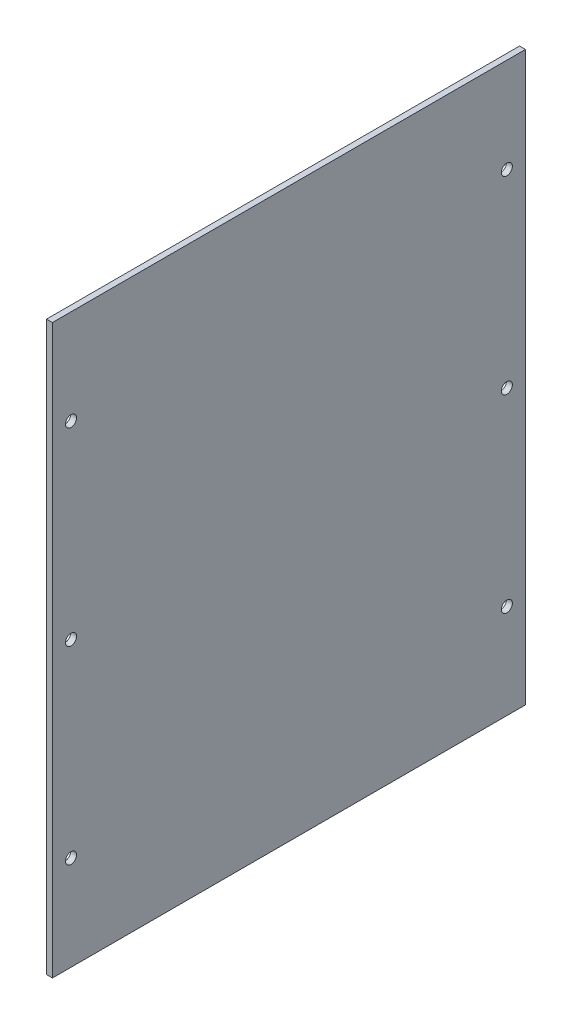
ISO-10303-21;
HEADER;
FILE_DESCRIPTION(('STEP AP214'),'2;1');
FILE_NAME('part.step','',(''),(''),'','','');
FILE_SCHEMA(('AUTOMOTIVE_DESIGN { 1 0 10303 214 1 1 1 1 }'));
ENDSEC;
DATA;
#1=APPLICATION_CONTEXT('core data for automotive mechanical design processes');
#2=APPLICATION_PROTOCOL_DEFINITION('international standard','automotive_design',2000,#1);
#3=PRODUCT_CONTEXT('',#1,'mechanical');
#4=PRODUCT('Part','Part','',(#3));
#5=PRODUCT_RELATED_PRODUCT_CATEGORY('part','',(#4));
#6=PRODUCT_DEFINITION_FORMATION('','',#4);
#7=PRODUCT_DEFINITION_CONTEXT('part definition',#1,'design');
#8=PRODUCT_DEFINITION('design','',#6,#7);
#9=PRODUCT_DEFINITION_SHAPE('','',#8);
#10=(LENGTH_UNIT() NAMED_UNIT(*) SI_UNIT(.MILLI.,.METRE.));
#11=(NAMED_UNIT(*) PLANE_ANGLE_UNIT() SI_UNIT($,.RADIAN.));
#12=(NAMED_UNIT(*) SI_UNIT($,.STERADIAN.) SOLID_ANGLE_UNIT());
#13=UNCERTAINTY_MEASURE_WITH_UNIT(LENGTH_MEASURE(1.E-05),#10,'distance_accuracy_value','');
#14=(GEOMETRIC_REPRESENTATION_CONTEXT(3) GLOBAL_UNCERTAINTY_ASSIGNED_CONTEXT((#13)) GLOBAL_UNIT_ASSIGNED_CONTEXT((#10,
#11,#12)) REPRESENTATION_CONTEXT('',''));
#15=CARTESIAN_POINT('',(0.,0.,0.));
#16=DIRECTION('',(0.,0.,1.));
#17=DIRECTION('',(1.,0.,0.));
#18=AXIS2_PLACEMENT_3D('',#15,#16,#17);
#19=CARTESIAN_POINT('',(-1.5875,152.4,127.));
#20=DIRECTION('',(1.,0.,0.));
#21=DIRECTION('',(0.,0.,-1.));
#22=AXIS2_PLACEMENT_3D('',#19,#20,#21);
#23=PLANE('',#22);
#24=DIRECTION('',(0.,1.,0.));
#25=VECTOR('',#24,1.);
#26=CARTESIAN_POINT('',(-1.5875,152.4,127.));
#27=LINE('',#26,#25);
#28=CARTESIAN_POINT('',(-1.5875,-152.4,127.));
#29=VERTEX_POINT('',#28);
#30=CARTESIAN_POINT('',(-1.5875,152.4,127.));
#31=VERTEX_POINT('',#30);
#32=EDGE_CURVE('E68',#29,#31,#27,.T.);
#33=ORIENTED_EDGE('',*,*,#32,.T.);
#34=DIRECTION('',(0.,0.,-1.));
#35=VECTOR('',#34,1.);
#36=CARTESIAN_POINT('',(-1.5875,152.4,0.));
#37=LINE('',#36,#35);
#38=CARTESIAN_POINT('',(-1.5875,152.4,-127.));
#39=VERTEX_POINT('',#38);
#40=EDGE_CURVE('E64',#31,#39,#37,.T.);
#41=ORIENTED_EDGE('',*,*,#40,.T.);
#42=DIRECTION('',(0.,1.,0.));
#43=VECTOR('',#42,1.);
#44=CARTESIAN_POINT('',(-1.5875,152.4,-127.));
#45=LINE('',#44,#43);
#46=CARTESIAN_POINT('',(-1.5875,-152.4,-127.));
#47=VERTEX_POINT('',#46);
#48=EDGE_CURVE('E295',#39,#47,#45,.F.);
#49=ORIENTED_EDGE('',*,*,#48,.T.);
#50=DIRECTION('',(0.,0.,-1.));
#51=VECTOR('',#50,1.);
#52=CARTESIAN_POINT('',(-1.5875,-152.4,0.));
#53=LINE('',#52,#51);
#54=EDGE_CURVE('E70',#29,#47,#53,.T.);
#55=ORIENTED_EDGE('',*,*,#54,.F.);
#56=EDGE_LOOP('',(#33,#41,#49,#55));
#57=FACE_BOUND('',#56,.T.);
#58=CARTESIAN_POINT('',(-1.5875,0.,-117.));
#59=DIRECTION('',(1.,0.,0.));
#60=DIRECTION('',(0.,0.,-1.));
#61=AXIS2_PLACEMENT_3D('',#58,#59,#60);
#62=CIRCLE('',#61,2.9718);
#63=CARTESIAN_POINT('',(-1.5875,0.,-119.9718));
#64=VERTEX_POINT('',#63);
#65=EDGE_CURVE('E77',#64,#64,#62,.T.);
#66=ORIENTED_EDGE('',*,*,#65,.T.);
#67=EDGE_LOOP('',(#66));
#68=FACE_BOUND('',#67,.T.);
#69=CARTESIAN_POINT('',(-1.5875,101.599999999999,117.));
#70=DIRECTION('',(1.,0.,0.));
#71=DIRECTION('',(0.,0.,-1.));
#72=AXIS2_PLACEMENT_3D('',#69,#70,#71);
#73=CIRCLE('',#72,2.9718);
#74=CARTESIAN_POINT('',(-1.5875,101.599999999999,114.0282));
#75=VERTEX_POINT('',#74);
#76=EDGE_CURVE('E124',#75,#75,#73,.T.);
#77=ORIENTED_EDGE('',*,*,#76,.T.);
#78=EDGE_LOOP('',(#77));
#79=FACE_BOUND('',#78,.T.);
#80=CARTESIAN_POINT('',(-1.5875,-101.600000000001,116.999999999999));
#81=DIRECTION('',(1.,0.,0.));
#82=DIRECTION('',(0.,0.,-1.));
#83=AXIS2_PLACEMENT_3D('',#80,#81,#82);
#84=CIRCLE('',#83,2.9718);
#85=CARTESIAN_POINT('',(-1.5875,-101.600000000001,114.028199999999));
#86=VERTEX_POINT('',#85);
#87=EDGE_CURVE('E127',#86,#86,#84,.T.);
#88=ORIENTED_EDGE('',*,*,#87,.T.);
#89=EDGE_LOOP('',(#88));
#90=FACE_BOUND('',#89,.T.);
#91=CARTESIAN_POINT('',(-1.5875,-8.32667268468867E-13,117.));
#92=DIRECTION('',(1.,0.,0.));
#93=DIRECTION('',(0.,0.,-1.));
#94=AXIS2_PLACEMENT_3D('',#91,#92,#93);
#95=CIRCLE('',#94,2.9718);
#96=CARTESIAN_POINT('',(-1.5875,-8.32667268468867E-13,114.0282));
#97=VERTEX_POINT('',#96);
#98=EDGE_CURVE('E131',#97,#97,#95,.T.);
#99=ORIENTED_EDGE('',*,*,#98,.T.);
#100=EDGE_LOOP('',(#99));
#101=FACE_BOUND('',#100,.T.);
#102=CARTESIAN_POINT('',(-1.5875,-101.6,-116.999999999999));
#103=DIRECTION('',(1.,0.,0.));
#104=DIRECTION('',(0.,0.,-1.));
#105=AXIS2_PLACEMENT_3D('',#102,#103,#104);
#106=CIRCLE('',#105,2.9718);
#107=CARTESIAN_POINT('',(-1.5875,-101.6,-119.971799999999));
#108=VERTEX_POINT('',#107);
#109=EDGE_CURVE('E134',#108,#108,#106,.T.);
#110=ORIENTED_EDGE('',*,*,#109,.T.);
#111=EDGE_LOOP('',(#110));
#112=FACE_BOUND('',#111,.T.);
#113=CARTESIAN_POINT('',(-1.5875,101.6,-116.999999999999));
#114=DIRECTION('',(1.,0.,0.));
#115=DIRECTION('',(0.,0.,-1.));
#116=AXIS2_PLACEMENT_3D('',#113,#114,#115);
#117=CIRCLE('',#116,2.9718);
#118=CARTESIAN_POINT('',(-1.5875,101.6,-119.971799999999));
#119=VERTEX_POINT('',#118);
#120=EDGE_CURVE('E20',#119,#119,#117,.T.);
#121=ORIENTED_EDGE('',*,*,#120,.T.);
#122=EDGE_LOOP('',(#121));
#123=FACE_BOUND('',#122,.T.);
#124=ADVANCED_FACE('F17',(#57,#68,#79,#90,#101,#112,#123),#23,.F.);
#125=CARTESIAN_POINT('',(-1.5875,101.6,-116.999999999999));
#126=DIRECTION('',(1.,0.,0.));
#127=DIRECTION('',(0.,0.,-1.));
#128=AXIS2_PLACEMENT_3D('',#125,#126,#127);
#129=CYLINDRICAL_SURFACE('',#128,2.9718);
#130=ORIENTED_EDGE('',*,*,#120,.F.);
#131=EDGE_LOOP('',(#130));
#132=FACE_BOUND('',#131,.T.);
#133=CARTESIAN_POINT('',(1.5875,101.6,-116.999999999999));
#134=DIRECTION('',(1.,0.,0.));
#135=DIRECTION('',(0.,0.,-1.));
#136=AXIS2_PLACEMENT_3D('',#133,#134,#135);
#137=CIRCLE('',#136,2.9718);
#138=CARTESIAN_POINT('',(1.5875,101.6,-119.971799999999));
#139=VERTEX_POINT('',#138);
#140=EDGE_CURVE('E117',#139,#139,#137,.T.);
#141=ORIENTED_EDGE('',*,*,#140,.T.);
#142=EDGE_LOOP('',(#141));
#143=FACE_BOUND('',#142,.T.);
#144=ADVANCED_FACE('F144',(#132,#143),#129,.F.);
#145=CARTESIAN_POINT('',(-1.5875,-101.6,-116.999999999999));
#146=DIRECTION('',(1.,0.,0.));
#147=DIRECTION('',(0.,0.,-1.));
#148=AXIS2_PLACEMENT_3D('',#145,#146,#147);
#149=CYLINDRICAL_SURFACE('',#148,2.9718);
#150=ORIENTED_EDGE('',*,*,#109,.F.);
#151=EDGE_LOOP('',(#150));
#152=FACE_BOUND('',#151,.T.);
#153=CARTESIAN_POINT('',(1.5875,-101.6,-116.999999999999));
#154=DIRECTION('',(1.,0.,0.));
#155=DIRECTION('',(0.,0.,-1.));
#156=AXIS2_PLACEMENT_3D('',#153,#154,#155);
#157=CIRCLE('',#156,2.9718);
#158=CARTESIAN_POINT('',(1.5875,-101.6,-119.971799999999));
#159=VERTEX_POINT('',#158);
#160=EDGE_CURVE('E113',#159,#159,#157,.T.);
#161=ORIENTED_EDGE('',*,*,#160,.T.);
#162=EDGE_LOOP('',(#161));
#163=FACE_BOUND('',#162,.T.);
#164=ADVANCED_FACE('F147',(#152,#163),#149,.F.);
#165=CARTESIAN_POINT('',(-1.5875,-8.32667268468867E-13,117.));
#166=DIRECTION('',(1.,0.,0.));
#167=DIRECTION('',(0.,0.,-1.));
#168=AXIS2_PLACEMENT_3D('',#165,#166,#167);
#169=CYLINDRICAL_SURFACE('',#168,2.9718);
#170=ORIENTED_EDGE('',*,*,#98,.F.);
#171=EDGE_LOOP('',(#170));
#172=FACE_BOUND('',#171,.T.);
#173=CARTESIAN_POINT('',(1.5875,-8.32667268468867E-13,117.));
#174=DIRECTION('',(1.,0.,0.));
#175=DIRECTION('',(0.,0.,-1.));
#176=AXIS2_PLACEMENT_3D('',#173,#174,#175);
#177=CIRCLE('',#176,2.9718);
#178=CARTESIAN_POINT('',(1.5875,-8.32667268468867E-13,114.0282));
#179=VERTEX_POINT('',#178);
#180=EDGE_CURVE('E109',#179,#179,#177,.T.);
#181=ORIENTED_EDGE('',*,*,#180,.T.);
#182=EDGE_LOOP('',(#181));
#183=FACE_BOUND('',#182,.T.);
#184=ADVANCED_FACE('F182',(#172,#183),#169,.F.);
#185=CARTESIAN_POINT('',(-1.5875,-101.600000000001,116.999999999999));
#186=DIRECTION('',(1.,0.,0.));
#187=DIRECTION('',(0.,0.,-1.));
#188=AXIS2_PLACEMENT_3D('',#185,#186,#187);
#189=CYLINDRICAL_SURFACE('',#188,2.9718);
#190=ORIENTED_EDGE('',*,*,#87,.F.);
#191=EDGE_LOOP('',(#190));
#192=FACE_BOUND('',#191,.T.);
#193=CARTESIAN_POINT('',(1.5875,-101.600000000001,116.999999999999));
#194=DIRECTION('',(1.,0.,0.));
#195=DIRECTION('',(0.,0.,-1.));
#196=AXIS2_PLACEMENT_3D('',#193,#194,#195);
#197=CIRCLE('',#196,2.9718);
#198=CARTESIAN_POINT('',(1.5875,-101.600000000001,114.028199999999));
#199=VERTEX_POINT('',#198);
#200=EDGE_CURVE('E105',#199,#199,#197,.T.);
#201=ORIENTED_EDGE('',*,*,#200,.T.);
#202=EDGE_LOOP('',(#201));
#203=FACE_BOUND('',#202,.T.);
#204=ADVANCED_FACE('F178',(#192,#203),#189,.F.);
#205=CARTESIAN_POINT('',(-1.5875,101.599999999999,117.));
#206=DIRECTION('',(1.,0.,0.));
#207=DIRECTION('',(0.,0.,-1.));
#208=AXIS2_PLACEMENT_3D('',#205,#206,#207);
#209=CYLINDRICAL_SURFACE('',#208,2.9718);
#210=ORIENTED_EDGE('',*,*,#76,.F.);
#211=EDGE_LOOP('',(#210));
#212=FACE_BOUND('',#211,.T.);
#213=CARTESIAN_POINT('',(1.5875,101.599999999999,117.));
#214=DIRECTION('',(1.,0.,0.));
#215=DIRECTION('',(0.,0.,-1.));
#216=AXIS2_PLACEMENT_3D('',#213,#214,#215);
#217=CIRCLE('',#216,2.9718);
#218=CARTESIAN_POINT('',(1.5875,101.599999999999,114.0282));
#219=VERTEX_POINT('',#218);
#220=EDGE_CURVE('E101',#219,#219,#217,.T.);
#221=ORIENTED_EDGE('',*,*,#220,.T.);
#222=EDGE_LOOP('',(#221));
#223=FACE_BOUND('',#222,.T.);
#224=ADVANCED_FACE('F174',(#212,#223),#209,.F.);
#225=CARTESIAN_POINT('',(-1.5875,0.,-117.));
#226=DIRECTION('',(1.,0.,0.));
#227=DIRECTION('',(0.,0.,-1.));
#228=AXIS2_PLACEMENT_3D('',#225,#226,#227);
#229=CYLINDRICAL_SURFACE('',#228,2.9718);
#230=ORIENTED_EDGE('',*,*,#65,.F.);
#231=EDGE_LOOP('',(#230));
#232=FACE_BOUND('',#231,.T.);
#233=CARTESIAN_POINT('',(1.5875,0.,-117.));
#234=DIRECTION('',(1.,0.,0.));
#235=DIRECTION('',(0.,0.,-1.));
#236=AXIS2_PLACEMENT_3D('',#233,#234,#235);
#237=CIRCLE('',#236,2.9718);
#238=CARTESIAN_POINT('',(1.5875,0.,-119.9718));
#239=VERTEX_POINT('',#238);
#240=EDGE_CURVE('E97',#239,#239,#237,.T.);
#241=ORIENTED_EDGE('',*,*,#240,.T.);
#242=EDGE_LOOP('',(#241));
#243=FACE_BOUND('',#242,.T.);
#244=ADVANCED_FACE('F171',(#232,#243),#229,.F.);
#245=CARTESIAN_POINT('',(-1.5875,152.4,127.));
#246=DIRECTION('',(0.,0.,-1.));
#247=DIRECTION('',(-1.,0.,0.));
#248=AXIS2_PLACEMENT_3D('',#245,#246,#247);
#249=PLANE('',#248);
#250=DIRECTION('',(0.,1.,0.));
#251=VECTOR('',#250,1.);
#252=CARTESIAN_POINT('',(1.5875,152.4,127.));
#253=LINE('',#252,#251);
#254=CARTESIAN_POINT('',(1.5875,-152.4,127.));
#255=VERTEX_POINT('',#254);
#256=CARTESIAN_POINT('',(1.5875,152.4,127.));
#257=VERTEX_POINT('',#256);
#258=EDGE_CURVE('E89',#255,#257,#253,.T.);
#259=ORIENTED_EDGE('',*,*,#258,.T.);
#260=DIRECTION('',(1.,0.,0.));
#261=VECTOR('',#260,1.);
#262=CARTESIAN_POINT('',(0.,152.4,127.));
#263=LINE('',#262,#261);
#264=EDGE_CURVE('E76',#257,#31,#263,.F.);
#265=ORIENTED_EDGE('',*,*,#264,.T.);
#266=ORIENTED_EDGE('',*,*,#32,.F.);
#267=DIRECTION('',(1.,0.,0.));
#268=VECTOR('',#267,1.);
#269=CARTESIAN_POINT('',(0.,-152.4,127.));
#270=LINE('',#269,#268);
#271=EDGE_CURVE('E298',#255,#29,#270,.F.);
#272=ORIENTED_EDGE('',*,*,#271,.F.);
#273=EDGE_LOOP('',(#259,#265,#266,#272));
#274=FACE_BOUND('',#273,.T.);
#275=ADVANCED_FACE('F88',(#274),#249,.F.);
#276=CARTESIAN_POINT('',(0.,152.4,0.));
#277=DIRECTION('',(0.,-1.,0.));
#278=DIRECTION('',(0.,0.,-1.));
#279=AXIS2_PLACEMENT_3D('',#276,#277,#278);
#280=PLANE('',#279);
#281=DIRECTION('',(1.,0.,0.));
#282=VECTOR('',#281,1.);
#283=CARTESIAN_POINT('',(-1.5875,152.4,-127.));
#284=LINE('',#283,#282);
#285=CARTESIAN_POINT('',(1.5875,152.4,-127.));
#286=VERTEX_POINT('',#285);
#287=EDGE_CURVE('E84',#286,#39,#284,.F.);
#288=ORIENTED_EDGE('',*,*,#287,.T.);
#289=ORIENTED_EDGE('',*,*,#40,.F.);
#290=ORIENTED_EDGE('',*,*,#264,.F.);
#291=DIRECTION('',(0.,0.,1.));
#292=VECTOR('',#291,1.);
#293=CARTESIAN_POINT('',(1.5875,152.4,127.));
#294=LINE('',#293,#292);
#295=EDGE_CURVE('E310',#257,#286,#294,.F.);
#296=ORIENTED_EDGE('',*,*,#295,.T.);
#297=EDGE_LOOP('',(#288,#289,#290,#296));
#298=FACE_BOUND('',#297,.T.);
#299=ADVANCED_FACE('F81',(#298),#280,.F.);
#300=CARTESIAN_POINT('',(-1.5875,152.4,-127.));
#301=DIRECTION('',(0.,0.,1.));
#302=DIRECTION('',(1.,0.,0.));
#303=AXIS2_PLACEMENT_3D('',#300,#301,#302);
#304=PLANE('',#303);
#305=ORIENTED_EDGE('',*,*,#48,.F.);
#306=ORIENTED_EDGE('',*,*,#287,.F.);
#307=DIRECTION('',(0.,1.,0.));
#308=VECTOR('',#307,1.);
#309=CARTESIAN_POINT('',(1.5875,152.4,-127.));
#310=LINE('',#309,#308);
#311=CARTESIAN_POINT('',(1.5875,-152.4,-127.));
#312=VERTEX_POINT('',#311);
#313=EDGE_CURVE('E27',#286,#312,#310,.F.);
#314=ORIENTED_EDGE('',*,*,#313,.T.);
#315=DIRECTION('',(1.,0.,0.));
#316=VECTOR('',#315,1.);
#317=CARTESIAN_POINT('',(0.,-152.4,-127.));
#318=LINE('',#317,#316);
#319=EDGE_CURVE('E38',#47,#312,#318,.T.);
#320=ORIENTED_EDGE('',*,*,#319,.F.);
#321=EDGE_LOOP('',(#305,#306,#314,#320));
#322=FACE_BOUND('',#321,.T.);
#323=ADVANCED_FACE('F159',(#322),#304,.F.);
#324=CARTESIAN_POINT('',(0.,-152.4,0.));
#325=DIRECTION('',(0.,-1.,0.));
#326=DIRECTION('',(0.,0.,-1.));
#327=AXIS2_PLACEMENT_3D('',#324,#325,#326);
#328=PLANE('',#327);
#329=ORIENTED_EDGE('',*,*,#54,.T.);
#330=ORIENTED_EDGE('',*,*,#319,.T.);
#331=DIRECTION('',(0.,0.,1.));
#332=VECTOR('',#331,1.);
#333=CARTESIAN_POINT('',(1.5875,-152.4,127.));
#334=LINE('',#333,#332);
#335=EDGE_CURVE('E11',#312,#255,#334,.T.);
#336=ORIENTED_EDGE('',*,*,#335,.T.);
#337=ORIENTED_EDGE('',*,*,#271,.T.);
#338=EDGE_LOOP('',(#329,#330,#336,#337));
#339=FACE_BOUND('',#338,.T.);
#340=ADVANCED_FACE('F152',(#339),#328,.T.);
#341=CARTESIAN_POINT('',(1.5875,152.4,127.));
#342=DIRECTION('',(-1.,0.,0.));
#343=DIRECTION('',(0.,0.,1.));
#344=AXIS2_PLACEMENT_3D('',#341,#342,#343);
#345=PLANE('',#344);
#346=ORIENTED_EDGE('',*,*,#313,.F.);
#347=ORIENTED_EDGE('',*,*,#295,.F.);
#348=ORIENTED_EDGE('',*,*,#258,.F.);
#349=ORIENTED_EDGE('',*,*,#335,.F.);
#350=EDGE_LOOP('',(#346,#347,#348,#349));
#351=FACE_BOUND('',#350,.T.);
#352=ORIENTED_EDGE('',*,*,#240,.F.);
#353=EDGE_LOOP('',(#352));
#354=FACE_BOUND('',#353,.T.);
#355=ORIENTED_EDGE('',*,*,#220,.F.);
#356=EDGE_LOOP('',(#355));
#357=FACE_BOUND('',#356,.T.);
#358=ORIENTED_EDGE('',*,*,#200,.F.);
#359=EDGE_LOOP('',(#358));
#360=FACE_BOUND('',#359,.T.);
#361=ORIENTED_EDGE('',*,*,#180,.F.);
#362=EDGE_LOOP('',(#361));
#363=FACE_BOUND('',#362,.T.);
#364=ORIENTED_EDGE('',*,*,#160,.F.);
#365=EDGE_LOOP('',(#364));
#366=FACE_BOUND('',#365,.T.);
#367=ORIENTED_EDGE('',*,*,#140,.F.);
#368=EDGE_LOOP('',(#367));
#369=FACE_BOUND('',#368,.T.);
#370=ADVANCED_FACE('F150',(#351,#354,#357,#360,#363,#366,#369),#345,.F.);
#371=CLOSED_SHELL('',(#124,#144,#164,#184,#204,#224,#244,#275,#299,#323,#340,#370));
#372=MANIFOLD_SOLID_BREP('B1',#371);
#373=ADVANCED_BREP_SHAPE_REPRESENTATION('',(#18,#372),#14);
#374=SHAPE_DEFINITION_REPRESENTATION(#9,#373);
ENDSEC;
END-ISO-10303-21;
